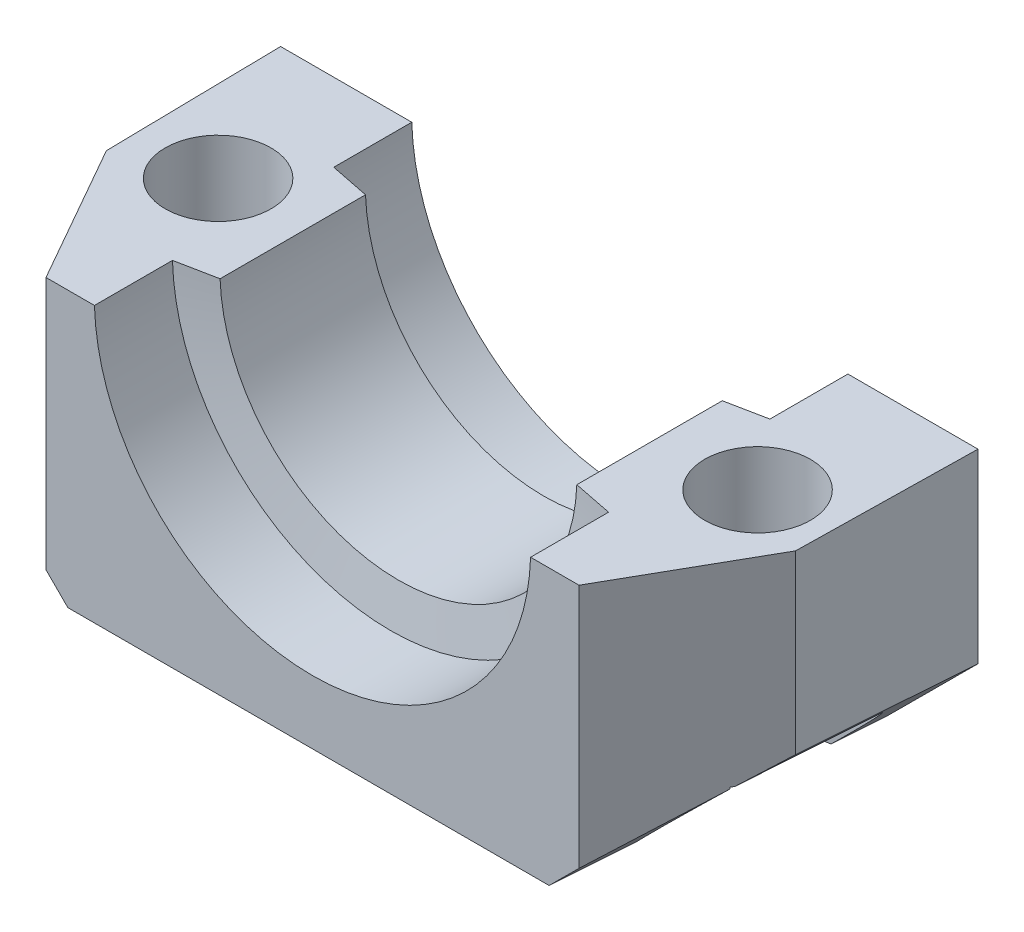
ISO-10303-21;
HEADER;
FILE_DESCRIPTION(('STEP AP214'),'2;1');
FILE_NAME('part.step','',(''),(''),'','','');
FILE_SCHEMA(('AUTOMOTIVE_DESIGN { 1 0 10303 214 1 1 1 1 }'));
ENDSEC;
DATA;
#1=APPLICATION_CONTEXT('core data for automotive mechanical design processes');
#2=APPLICATION_PROTOCOL_DEFINITION('international standard','automotive_design',2000,#1);
#3=PRODUCT_CONTEXT('',#1,'mechanical');
#4=PRODUCT('Part','Part','',(#3));
#5=PRODUCT_RELATED_PRODUCT_CATEGORY('part','',(#4));
#6=PRODUCT_DEFINITION_FORMATION('','',#4);
#7=PRODUCT_DEFINITION_CONTEXT('part definition',#1,'design');
#8=PRODUCT_DEFINITION('design','',#6,#7);
#9=PRODUCT_DEFINITION_SHAPE('','',#8);
#10=(LENGTH_UNIT() NAMED_UNIT(*) SI_UNIT(.MILLI.,.METRE.));
#11=(NAMED_UNIT(*) PLANE_ANGLE_UNIT() SI_UNIT($,.RADIAN.));
#12=(NAMED_UNIT(*) SI_UNIT($,.STERADIAN.) SOLID_ANGLE_UNIT());
#13=UNCERTAINTY_MEASURE_WITH_UNIT(LENGTH_MEASURE(1.E-05),#10,'distance_accuracy_value','');
#14=(GEOMETRIC_REPRESENTATION_CONTEXT(3) GLOBAL_UNCERTAINTY_ASSIGNED_CONTEXT((#13)) GLOBAL_UNIT_ASSIGNED_CONTEXT((#10,
#11,#12)) REPRESENTATION_CONTEXT('',''));
#15=CARTESIAN_POINT('',(0.,0.,0.));
#16=DIRECTION('',(0.,0.,1.));
#17=DIRECTION('',(1.,0.,0.));
#18=AXIS2_PLACEMENT_3D('',#15,#16,#17);
#19=CARTESIAN_POINT('',(74.7195,-65.6273640319845,32.1314205669099));
#20=DIRECTION('',(0.,0.,-1.));
#21=DIRECTION('',(0.,-1.,0.));
#22=AXIS2_PLACEMENT_3D('',#19,#20,#21);
#23=CYLINDRICAL_SURFACE('',#22,6.75);
#24=DIRECTION('',(0.,0.,1.));
#25=VECTOR('',#24,1.);
#26=CARTESIAN_POINT('',(81.4648687816164,-65.8773640319845,32.1314205669099));
#27=LINE('',#26,#25);
#28=CARTESIAN_POINT('',(81.4648687816164,-65.8773640319845,27.7999999999972));
#29=VERTEX_POINT('',#28);
#30=CARTESIAN_POINT('',(81.4648687816164,-65.8773640319845,33.2999999999972));
#31=VERTEX_POINT('',#30);
#32=EDGE_CURVE('E328',#29,#31,#27,.T.);
#33=ORIENTED_EDGE('',*,*,#32,.F.);
#34=CARTESIAN_POINT('',(74.7195,-65.6273640319846,27.7999999999972));
#35=DIRECTION('',(0.,0.,1.));
#36=DIRECTION('',(0.,1.,0.));
#37=AXIS2_PLACEMENT_3D('',#34,#35,#36);
#38=CIRCLE('',#37,6.75);
#39=CARTESIAN_POINT('',(67.9741312183843,-65.8773640319845,27.7999999999972));
#40=VERTEX_POINT('',#39);
#41=EDGE_CURVE('E283',#40,#29,#38,.T.);
#42=ORIENTED_EDGE('',*,*,#41,.F.);
#43=DIRECTION('',(0.,0.,-1.));
#44=VECTOR('',#43,1.);
#45=CARTESIAN_POINT('',(67.9741312183843,-65.8773640319845,32.1314205669099));
#46=LINE('',#45,#44);
#47=CARTESIAN_POINT('',(67.9741312183843,-65.8773640319845,33.2999999999972));
#48=VERTEX_POINT('',#47);
#49=EDGE_CURVE('E304',#48,#40,#46,.T.);
#50=ORIENTED_EDGE('',*,*,#49,.F.);
#51=CARTESIAN_POINT('',(74.7195,-65.6273640319845,33.2999999999972));
#52=DIRECTION('',(0.,0.,1.));
#53=DIRECTION('',(0.,1.,0.));
#54=AXIS2_PLACEMENT_3D('',#51,#52,#53);
#55=CIRCLE('',#54,6.75);
#56=EDGE_CURVE('E262',#48,#31,#55,.T.);
#57=ORIENTED_EDGE('',*,*,#56,.T.);
#58=EDGE_LOOP('',(#33,#42,#50,#57));
#59=FACE_BOUND('',#58,.T.);
#60=ADVANCED_FACE('F17',(#59),#23,.F.);
#61=CARTESIAN_POINT('',(74.7195,-65.627364031986,36.5499999999972));
#62=DIRECTION('',(0.,0.,-1.));
#63=DIRECTION('',(0.,-1.,0.));
#64=AXIS2_PLACEMENT_3D('',#61,#62,#63);
#65=PLANE('',#64);
#66=DIRECTION('',(0.,1.,0.));
#67=VECTOR('',#66,1.);
#68=CARTESIAN_POINT('',(64.6415,-68.352364031985,36.5499999999972));
#69=LINE('',#68,#67);
#70=CARTESIAN_POINT('',(64.6415,-75.4521268342688,36.5499999999973));
#71=VERTEX_POINT('',#70);
#72=CARTESIAN_POINT('',(64.6415,-65.8773640319845,36.5499999999972));
#73=VERTEX_POINT('',#72);
#74=EDGE_CURVE('E299',#71,#73,#69,.T.);
#75=ORIENTED_EDGE('',*,*,#74,.F.);
#76=DIRECTION('',(-0.707968543318457,0.706243967529311,0.));
#77=VECTOR('',#76,1.);
#78=CARTESIAN_POINT('',(66.142642401802,-76.9496125286265,36.5499999999973));
#79=LINE('',#78,#77);
#80=CARTESIAN_POINT('',(65.4687523428459,-76.2773640319845,36.5499999999973));
#81=VERTEX_POINT('',#80);
#82=EDGE_CURVE('E442',#81,#71,#79,.T.);
#83=ORIENTED_EDGE('',*,*,#82,.F.);
#84=DIRECTION('',(1.,0.,0.));
#85=VECTOR('',#84,1.);
#86=CARTESIAN_POINT('',(69.0945,-76.2773640319845,36.5499999999973));
#87=LINE('',#86,#85);
#88=CARTESIAN_POINT('',(83.6669141455119,-76.2773640319845,36.5499999999973));
#89=VERTEX_POINT('',#88);
#90=EDGE_CURVE('E279',#81,#89,#87,.T.);
#91=ORIENTED_EDGE('',*,*,#90,.T.);
#92=DIRECTION('',(-0.707968543318457,-0.70624396752931,0.));
#93=VECTOR('',#92,1.);
#94=CARTESIAN_POINT('',(83.1450607449544,-76.7979462238865,36.5499999999973));
#95=LINE('',#94,#93);
#96=CARTESIAN_POINT('',(84.7975000000009,-75.149532227814,36.5499999999973));
#97=VERTEX_POINT('',#96);
#98=EDGE_CURVE('E468',#97,#89,#95,.T.);
#99=ORIENTED_EDGE('',*,*,#98,.F.);
#100=DIRECTION('',(0.,-1.,0.));
#101=VECTOR('',#100,1.);
#102=CARTESIAN_POINT('',(84.7975,-69.1768111183165,36.5499999999972));
#103=LINE('',#102,#101);
#104=CARTESIAN_POINT('',(84.7975,-65.8773640319845,36.5499999999972));
#105=VERTEX_POINT('',#104);
#106=EDGE_CURVE('E11',#105,#97,#103,.T.);
#107=ORIENTED_EDGE('',*,*,#106,.F.);
#108=DIRECTION('',(-1.,0.,0.));
#109=VECTOR('',#108,1.);
#110=CARTESIAN_POINT('',(74.7195,-65.8773640319845,36.5499999999972));
#111=LINE('',#110,#109);
#112=CARTESIAN_POINT('',(82.9657112512353,-65.8773640319845,36.5499999999972));
#113=VERTEX_POINT('',#112);
#114=EDGE_CURVE('E332',#105,#113,#111,.T.);
#115=ORIENTED_EDGE('',*,*,#114,.T.);
#116=CARTESIAN_POINT('',(74.7195,-65.627364031983,36.5499999999972));
#117=DIRECTION('',(0.,0.,-1.));
#118=DIRECTION('',(0.,1.,0.));
#119=AXIS2_PLACEMENT_3D('',#116,#117,#118);
#120=CIRCLE('',#119,8.25);
#121=CARTESIAN_POINT('',(66.4732887487647,-65.8773640319845,36.5499999999972));
#122=VERTEX_POINT('',#121);
#123=EDGE_CURVE('E278',#113,#122,#120,.T.);
#124=ORIENTED_EDGE('',*,*,#123,.T.);
#125=DIRECTION('',(-1.,0.,0.));
#126=VECTOR('',#125,1.);
#127=CARTESIAN_POINT('',(74.7195,-65.8773640319845,36.5499999999972));
#128=LINE('',#127,#126);
#129=EDGE_CURVE('E289',#122,#73,#128,.T.);
#130=ORIENTED_EDGE('',*,*,#129,.T.);
#131=EDGE_LOOP('',(#75,#83,#91,#99,#107,#115,#124,#130));
#132=FACE_BOUND('',#131,.T.);
#133=ADVANCED_FACE('F506',(#132),#65,.F.);
#134=CARTESIAN_POINT('',(85.643017800899,-72.7262582046471,35.0635717147782));
#135=DIRECTION('',(0.869216267412119,0.,0.494432078718749));
#136=DIRECTION('',(0.,-1.,0.));
#137=AXIS2_PLACEMENT_3D('',#134,#135,#136);
#138=PLANE('',#137);
#139=DIRECTION('',(0.494432078718749,0.,-0.869216267412119));
#140=VECTOR('',#139,1.);
#141=CARTESIAN_POINT('',(85.6589690168994,-73.2773640319845,35.0355293262899));
#142=LINE('',#141,#140);
#143=CARTESIAN_POINT('',(86.8683590580363,-73.2773640319834,32.9094102036663));
#144=VERTEX_POINT('',#143);
#145=CARTESIAN_POINT('',(86.9372882853201,-73.2773640319845,32.7882319706308));
#146=VERTEX_POINT('',#145);
#147=EDGE_CURVE('E255',#144,#146,#142,.T.);
#148=ORIENTED_EDGE('',*,*,#147,.T.);
#149=DIRECTION('',(-0.453791213813399,-0.397036231984776,0.797769242799629));
#150=VECTOR('',#149,1.);
#151=CARTESIAN_POINT('',(86.0949788380888,-74.014327108646,34.2690199397803));
#152=LINE('',#151,#150);
#153=CARTESIAN_POINT('',(87.7674035144998,-72.5510700609377,31.3288815520671));
#154=VERTEX_POINT('',#153);
#155=EDGE_CURVE('E271',#154,#146,#152,.T.);
#156=ORIENTED_EDGE('',*,*,#155,.F.);
#157=DIRECTION('',(0.,1.,0.));
#158=VECTOR('',#157,1.);
#159=CARTESIAN_POINT('',(87.7674035144998,-69.1874964435554,31.328881552067));
#160=LINE('',#159,#158);
#161=CARTESIAN_POINT('',(87.7674035144998,-65.8773640319845,31.328881552067));
#162=VERTEX_POINT('',#161);
#163=EDGE_CURVE('E361',#154,#162,#160,.T.);
#164=ORIENTED_EDGE('',*,*,#163,.T.);
#165=DIRECTION('',(-0.494432078718749,0.,0.869216267412119));
#166=VECTOR('',#165,1.);
#167=CARTESIAN_POINT('',(93.2963989890606,-65.8773640319845,21.6088552516092));
#168=LINE('',#167,#166);
#169=EDGE_CURVE('E28',#162,#105,#168,.T.);
#170=ORIENTED_EDGE('',*,*,#169,.T.);
#171=ORIENTED_EDGE('',*,*,#106,.T.);
#172=DIRECTION('',(-0.453791213813399,-0.397036231984776,0.797769242799629));
#173=VECTOR('',#172,1.);
#174=CARTESIAN_POINT('',(86.0949788380888,-74.014327108646,34.2690199397803));
#175=LINE('',#174,#173);
#176=CARTESIAN_POINT('',(86.8683590580363,-73.3376723849039,32.9094102036663));
#177=VERTEX_POINT('',#176);
#178=EDGE_CURVE('E453',#177,#97,#175,.T.);
#179=ORIENTED_EDGE('',*,*,#178,.F.);
#180=DIRECTION('',(0.,1.,0.));
#181=VECTOR('',#180,1.);
#182=CARTESIAN_POINT('',(86.8683590580364,-76.2773640319834,32.9094102036663));
#183=LINE('',#182,#181);
#184=EDGE_CURVE('E358',#177,#144,#183,.T.);
#185=ORIENTED_EDGE('',*,*,#184,.T.);
#186=EDGE_LOOP('',(#148,#156,#164,#170,#171,#179,#185));
#187=FACE_BOUND('',#186,.T.);
#188=ADVANCED_FACE('F531',(#187),#138,.T.);
#189=CARTESIAN_POINT('',(74.7195,-65.627364031983,36.5499999999972));
#190=DIRECTION('',(0.,0.,-1.));
#191=DIRECTION('',(0.,-1.,0.));
#192=AXIS2_PLACEMENT_3D('',#189,#190,#191);
#193=CYLINDRICAL_SURFACE('',#192,8.25);
#194=CARTESIAN_POINT('',(74.7195,-65.6273640319846,27.4999999999972));
#195=DIRECTION('',(0.,0.,1.));
#196=DIRECTION('',(0.,1.,0.));
#197=AXIS2_PLACEMENT_3D('',#194,#195,#196);
#198=CIRCLE('',#197,8.25);
#199=CARTESIAN_POINT('',(66.4732887487647,-65.8773640319845,27.4999999999972));
#200=VERTEX_POINT('',#199);
#201=CARTESIAN_POINT('',(82.9657112512356,-65.8773640319845,27.4999999999972));
#202=VERTEX_POINT('',#201);
#203=EDGE_CURVE('E320',#200,#202,#198,.T.);
#204=ORIENTED_EDGE('',*,*,#203,.T.);
#205=DIRECTION('',(0.,0.,1.));
#206=VECTOR('',#205,1.);
#207=CARTESIAN_POINT('',(82.9657112512353,-65.8773640319845,36.5499999999972));
#208=LINE('',#207,#206);
#209=CARTESIAN_POINT('',(82.9657112512353,-65.8773640319846,24.5499999999972));
#210=VERTEX_POINT('',#209);
#211=EDGE_CURVE('E277',#210,#202,#208,.T.);
#212=ORIENTED_EDGE('',*,*,#211,.F.);
#213=CARTESIAN_POINT('',(74.7195,-65.627364031983,24.5499999999972));
#214=DIRECTION('',(0.,0.,-1.));
#215=DIRECTION('',(0.,1.,0.));
#216=AXIS2_PLACEMENT_3D('',#213,#214,#215);
#217=CIRCLE('',#216,8.25);
#218=CARTESIAN_POINT('',(66.4732887487647,-65.8773640319845,24.5499999999972));
#219=VERTEX_POINT('',#218);
#220=EDGE_CURVE('E310',#210,#219,#217,.T.);
#221=ORIENTED_EDGE('',*,*,#220,.T.);
#222=DIRECTION('',(0.,0.,-1.));
#223=VECTOR('',#222,1.);
#224=CARTESIAN_POINT('',(66.4732887487647,-65.8773640319845,36.5499999999972));
#225=LINE('',#224,#223);
#226=EDGE_CURVE('E391',#200,#219,#225,.T.);
#227=ORIENTED_EDGE('',*,*,#226,.F.);
#228=EDGE_LOOP('',(#204,#212,#221,#227));
#229=FACE_BOUND('',#228,.T.);
#230=ADVANCED_FACE('F389',(#229),#193,.F.);
#231=CARTESIAN_POINT('',(62.9695000000013,-65.8773640319845,-13.4500000000029));
#232=DIRECTION('',(0.,-1.,0.));
#233=DIRECTION('',(-1.,0.,0.));
#234=AXIS2_PLACEMENT_3D('',#231,#232,#233);
#235=PLANE('',#234);
#236=CARTESIAN_POINT('',(85.05,-65.8773640319834,30.0499999999974));
#237=DIRECTION('',(0.,-1.,0.));
#238=DIRECTION('',(1.,0.,0.));
#239=AXIS2_PLACEMENT_3D('',#236,#237,#238);
#240=CIRCLE('',#239,2.);
#241=CARTESIAN_POINT('',(83.05,-65.8773640319834,30.0499999999974));
#242=VERTEX_POINT('',#241);
#243=EDGE_CURVE('E249',#242,#242,#240,.T.);
#244=ORIENTED_EDGE('',*,*,#243,.T.);
#245=EDGE_LOOP('',(#244));
#246=FACE_BOUND('',#245,.T.);
#247=DIRECTION('',(-0.0174524064372835,0.,0.999847695156391));
#248=VECTOR('',#247,1.);
#249=CARTESIAN_POINT('',(88.3496446745002,-65.8773640319845,-2.02769216420523));
#250=LINE('',#249,#248);
#251=CARTESIAN_POINT('',(87.8857293321319,-65.8773640319845,24.5499999999972));
#252=VERTEX_POINT('',#251);
#253=EDGE_CURVE('E365',#252,#162,#250,.T.);
#254=ORIENTED_EDGE('',*,*,#253,.F.);
#255=DIRECTION('',(-1.,0.,0.));
#256=VECTOR('',#255,1.);
#257=CARTESIAN_POINT('',(74.7195,-65.8773640319845,24.5499999999972));
#258=LINE('',#257,#256);
#259=EDGE_CURVE('E313',#252,#210,#258,.T.);
#260=ORIENTED_EDGE('',*,*,#259,.T.);
#261=ORIENTED_EDGE('',*,*,#211,.T.);
#262=CARTESIAN_POINT('',(82.9657112512356,-65.8773640319845,27.4999999999972));
#263=CARTESIAN_POINT('',(82.1402478929447,-65.8773640319845,27.6650168541214));
#264=CARTESIAN_POINT('',(81.4648687816158,-65.8773640319846,27.7999999999973));
#265=(BOUNDED_CURVE() B_SPLINE_CURVE(2,(#262,#263,#264),.UNSPECIFIED.,.F.,
.F.) B_SPLINE_CURVE_WITH_KNOTS((3,3),(-5.64834179297389,-5.62956906046879),
.UNSPECIFIED.) CURVE() GEOMETRIC_REPRESENTATION_ITEM() RATIONAL_B_SPLINE_CURVE((3.32352941176481,
3.68082217396358,4.03571428571474)) REPRESENTATION_ITEM(''));
#266=EDGE_CURVE('E314',#202,#29,#265,.T.);
#267=ORIENTED_EDGE('',*,*,#266,.T.);
#268=ORIENTED_EDGE('',*,*,#32,.T.);
#269=CARTESIAN_POINT('',(81.4648687816165,-65.8773640319845,33.2999999999972));
#270=CARTESIAN_POINT('',(82.1402478929451,-65.8773640319845,33.4349831458731));
#271=CARTESIAN_POINT('',(82.9657112512356,-65.8773640319844,33.5999999999972));
#272=(BOUNDED_CURVE() B_SPLINE_CURVE(2,(#269,#270,#271),.UNSPECIFIED.,.F.,
.F.) B_SPLINE_CURVE_WITH_KNOTS((3,3),(-0.0791610960547726,-0.0603883635496829),
.UNSPECIFIED.) CURVE() GEOMETRIC_REPRESENTATION_ITEM() RATIONAL_B_SPLINE_CURVE((4.03571428571438,
3.68082217396338,3.32352941176478)) REPRESENTATION_ITEM(''));
#273=CARTESIAN_POINT('',(82.9657112512356,-65.8773640319845,33.5999999999972));
#274=VERTEX_POINT('',#273);
#275=EDGE_CURVE('E256',#31,#274,#272,.T.);
#276=ORIENTED_EDGE('',*,*,#275,.T.);
#277=DIRECTION('',(0.,0.,1.));
#278=VECTOR('',#277,1.);
#279=CARTESIAN_POINT('',(82.9657112512353,-65.8773640319845,36.5499999999972));
#280=LINE('',#279,#278);
#281=EDGE_CURVE('E273',#274,#113,#280,.T.);
#282=ORIENTED_EDGE('',*,*,#281,.T.);
#283=ORIENTED_EDGE('',*,*,#114,.F.);
#284=ORIENTED_EDGE('',*,*,#169,.F.);
#285=EDGE_LOOP('',(#254,#260,#261,#267,#268,#276,#282,#283,#284));
#286=FACE_BOUND('',#285,.T.);
#287=ADVANCED_FACE('F382',(#246,#286),#235,.F.);
#288=CARTESIAN_POINT('',(74.7195,-65.627364031983,36.5499999999972));
#289=DIRECTION('',(0.,0.,-1.));
#290=DIRECTION('',(0.,-1.,0.));
#291=AXIS2_PLACEMENT_3D('',#288,#289,#290);
#292=CYLINDRICAL_SURFACE('',#291,8.25);
#293=DIRECTION('',(0.,0.,-1.));
#294=VECTOR('',#293,1.);
#295=CARTESIAN_POINT('',(66.4732887487647,-65.8773640319845,36.5499999999972));
#296=LINE('',#295,#294);
#297=CARTESIAN_POINT('',(66.4732887487647,-65.8773640319845,33.5999999999972));
#298=VERTEX_POINT('',#297);
#299=EDGE_CURVE('E327',#122,#298,#296,.T.);
#300=ORIENTED_EDGE('',*,*,#299,.F.);
#301=ORIENTED_EDGE('',*,*,#123,.F.);
#302=ORIENTED_EDGE('',*,*,#281,.F.);
#303=CARTESIAN_POINT('',(74.7195,-65.6273640319845,33.5999999999972));
#304=DIRECTION('',(0.,0.,1.));
#305=DIRECTION('',(0.,1.,0.));
#306=AXIS2_PLACEMENT_3D('',#303,#304,#305);
#307=CIRCLE('',#306,8.25);
#308=EDGE_CURVE('E263',#298,#274,#307,.T.);
#309=ORIENTED_EDGE('',*,*,#308,.F.);
#310=EDGE_LOOP('',(#300,#301,#302,#309));
#311=FACE_BOUND('',#310,.T.);
#312=ADVANCED_FACE('F510',(#311),#292,.F.);
#313=CARTESIAN_POINT('',(74.7195,-65.6273640319845,33.5999999999972));
#314=DIRECTION('',(0.,0.,1.));
#315=DIRECTION('',(0.,-1.,0.));
#316=AXIS2_PLACEMENT_3D('',#313,#314,#315);
#317=CONICAL_SURFACE('',#316,8.25,1.37340076694502);
#318=ORIENTED_EDGE('',*,*,#308,.T.);
#319=ORIENTED_EDGE('',*,*,#275,.F.);
#320=ORIENTED_EDGE('',*,*,#56,.F.);
#321=CARTESIAN_POINT('',(66.4732887487649,-65.8773640319845,33.5999999999972));
#322=CARTESIAN_POINT('',(67.2987521070558,-65.8773640319845,33.434983145873));
#323=CARTESIAN_POINT('',(67.9741312183848,-65.8773640319845,33.2999999999971));
#324=(BOUNDED_CURVE() B_SPLINE_CURVE(2,(#321,#322,#323),.UNSPECIFIED.,.F.,
.F.) B_SPLINE_CURVE_WITH_KNOTS((3,3),(-5.64834179297383,-5.62956906046873),
.UNSPECIFIED.) CURVE() GEOMETRIC_REPRESENTATION_ITEM() RATIONAL_B_SPLINE_CURVE((3.3235294117647,
3.6808221739635,4.0357142857147)) REPRESENTATION_ITEM(''));
#325=EDGE_CURVE('E309',#298,#48,#324,.T.);
#326=ORIENTED_EDGE('',*,*,#325,.F.);
#327=EDGE_LOOP('',(#318,#319,#320,#326));
#328=FACE_BOUND('',#327,.T.);
#329=ADVANCED_FACE('F541',(#328),#317,.F.);
#330=CARTESIAN_POINT('',(74.7195,-65.6273640319846,27.7999999999972));
#331=DIRECTION('',(0.,0.,-1.));
#332=DIRECTION('',(0.,-1.,0.));
#333=AXIS2_PLACEMENT_3D('',#330,#331,#332);
#334=CONICAL_SURFACE('',#333,6.75,1.37340076694502);
#335=ORIENTED_EDGE('',*,*,#41,.T.);
#336=ORIENTED_EDGE('',*,*,#266,.F.);
#337=ORIENTED_EDGE('',*,*,#203,.F.);
#338=CARTESIAN_POINT('',(67.9741312183848,-65.8773640319845,27.7999999999973));
#339=CARTESIAN_POINT('',(67.2987521070558,-65.8773640319845,27.6650168541213));
#340=CARTESIAN_POINT('',(66.4732887487648,-65.8773640319845,27.4999999999972));
#341=(BOUNDED_CURVE() B_SPLINE_CURVE(2,(#338,#339,#340),.UNSPECIFIED.,.F.,
.F.) B_SPLINE_CURVE_WITH_KNOTS((3,3),(-0.635693768744279,-0.517208865063031),
.UNSPECIFIED.) CURVE() GEOMETRIC_REPRESENTATION_ITEM() RATIONAL_B_SPLINE_CURVE((25.4642857142881,
23.2250107082828,20.9705882352939)) REPRESENTATION_ITEM(''));
#342=EDGE_CURVE('E308',#40,#200,#341,.T.);
#343=ORIENTED_EDGE('',*,*,#342,.F.);
#344=EDGE_LOOP('',(#335,#336,#337,#343));
#345=FACE_BOUND('',#344,.T.);
#346=ADVANCED_FACE('F19',(#345),#334,.F.);
#347=CARTESIAN_POINT('',(63.4695000000013,-76.2773640319845,-13.4510000000029));
#348=DIRECTION('',(0.,1.,0.));
#349=DIRECTION('',(1.,0.,0.));
#350=AXIS2_PLACEMENT_3D('',#347,#348,#349);
#351=PLANE('',#350);
#352=DIRECTION('',(1.,0.,0.));
#353=VECTOR('',#352,1.);
#354=CARTESIAN_POINT('',(69.0186666220901,-76.2773640319845,24.5499999999973));
#355=LINE('',#354,#353);
#356=CARTESIAN_POINT('',(64.6296305995235,-76.2773640319844,24.5499999999973));
#357=VERTEX_POINT('',#356);
#358=CARTESIAN_POINT('',(84.5060358888344,-76.2773640319844,24.5499999999973));
#359=VERTEX_POINT('',#358);
#360=EDGE_CURVE('E413',#357,#359,#355,.T.);
#361=ORIENTED_EDGE('',*,*,#360,.T.);
#362=DIRECTION('',(0.0697564737441488,0.,-0.997564050259823));
#363=VECTOR('',#362,1.);
#364=CARTESIAN_POINT('',(85.60361205377,-76.2773640319845,8.85392957393585));
#365=LINE('',#364,#363);
#366=CARTESIAN_POINT('',(84.3638094210118,-76.2773640319834,26.5839332492119));
#367=VERTEX_POINT('',#366);
#368=EDGE_CURVE('E343',#367,#359,#365,.T.);
#369=ORIENTED_EDGE('',*,*,#368,.F.);
#370=CARTESIAN_POINT('',(84.85,-76.2773640319845,30.0499999999977));
#371=DIRECTION('',(0.,1.,0.));
#372=DIRECTION('',(1.,0.,0.));
#373=AXIS2_PLACEMENT_3D('',#370,#371,#372);
#374=CIRCLE('',#373,3.5);
#375=CARTESIAN_POINT('',(83.8861577364624,-76.2773640319834,33.4146705768919));
#376=VERTEX_POINT('',#375);
#377=EDGE_CURVE('E192',#367,#376,#374,.T.);
#378=ORIENTED_EDGE('',*,*,#377,.T.);
#379=DIRECTION('',(0.0697564737441488,0.,-0.997564050259823));
#380=VECTOR('',#379,1.);
#381=CARTESIAN_POINT('',(85.60361205377,-76.2773640319845,8.85392957393585));
#382=LINE('',#381,#380);
#383=EDGE_CURVE('E300',#89,#376,#382,.T.);
#384=ORIENTED_EDGE('',*,*,#383,.F.);
#385=ORIENTED_EDGE('',*,*,#90,.F.);
#386=DIRECTION('',(0.069756473744149,0.,0.997564050259823));
#387=VECTOR('',#386,1.);
#388=CARTESIAN_POINT('',(63.478788331701,-76.2773640319845,8.09218881375554));
#389=LINE('',#388,#387);
#390=CARTESIAN_POINT('',(65.2573089860889,-76.2773640319834,33.5262191228166));
#391=VERTEX_POINT('',#390);
#392=EDGE_CURVE('E438',#391,#81,#389,.T.);
#393=ORIENTED_EDGE('',*,*,#392,.F.);
#394=CARTESIAN_POINT('',(64.85,-76.2773640319845,30.0499999999977));
#395=DIRECTION('',(0.,1.,0.));
#396=DIRECTION('',(1.,0.,0.));
#397=AXIS2_PLACEMENT_3D('',#394,#395,#396);
#398=CIRCLE('',#397,3.5);
#399=CARTESIAN_POINT('',(64.7695488880947,-76.2773640319834,26.5509247480785));
#400=VERTEX_POINT('',#399);
#401=EDGE_CURVE('E233',#391,#400,#398,.T.);
#402=ORIENTED_EDGE('',*,*,#401,.T.);
#403=DIRECTION('',(0.069756473744149,0.,0.997564050259823));
#404=VECTOR('',#403,1.);
#405=CARTESIAN_POINT('',(63.478788331701,-76.2773640319845,8.09218881375554));
#406=LINE('',#405,#404);
#407=EDGE_CURVE('E364',#357,#400,#406,.T.);
#408=ORIENTED_EDGE('',*,*,#407,.F.);
#409=EDGE_LOOP('',(#361,#369,#378,#384,#385,#393,#402,#408));
#410=FACE_BOUND('',#409,.T.);
#411=ADVANCED_FACE('F414',(#410),#351,.F.);
#412=CARTESIAN_POINT('',(64.65,-65.0310000000014,30.0499999999974));
#413=DIRECTION('',(0.,-1.,0.));
#414=DIRECTION('',(1.,0.,0.));
#415=AXIS2_PLACEMENT_3D('',#412,#413,#414);
#416=CYLINDRICAL_SURFACE('',#415,2.);
#417=CARTESIAN_POINT('',(64.65,-65.8773640319834,30.0499999999974));
#418=DIRECTION('',(0.,-1.,0.));
#419=DIRECTION('',(1.,0.,0.));
#420=AXIS2_PLACEMENT_3D('',#417,#418,#419);
#421=CIRCLE('',#420,2.);
#422=CARTESIAN_POINT('',(62.65,-65.8773640319834,30.0499999999974));
#423=VERTEX_POINT('',#422);
#424=EDGE_CURVE('E351',#423,#423,#421,.T.);
#425=ORIENTED_EDGE('',*,*,#424,.F.);
#426=DIRECTION('',(0.,-1.,0.));
#427=VECTOR('',#426,1.);
#428=CARTESIAN_POINT('',(62.65,-65.0310000000014,30.0499999999974));
#429=LINE('',#428,#427);
#430=CARTESIAN_POINT('',(62.65,-73.2773640319845,30.0499999999976));
#431=VERTEX_POINT('',#430);
#432=EDGE_CURVE('E284',#423,#431,#429,.T.);
#433=ORIENTED_EDGE('',*,*,#432,.T.);
#434=CARTESIAN_POINT('',(64.65,-73.2773640319845,30.0499999999976));
#435=DIRECTION('',(0.,-1.,0.));
#436=DIRECTION('',(1.,0.,0.));
#437=AXIS2_PLACEMENT_3D('',#434,#435,#436);
#438=CIRCLE('',#437,2.);
#439=EDGE_CURVE('E222',#431,#431,#438,.T.);
#440=ORIENTED_EDGE('',*,*,#439,.T.);
#441=ORIENTED_EDGE('',*,*,#432,.F.);
#442=EDGE_LOOP('',(#425,#433,#440,#441));
#443=FACE_BOUND('',#442,.T.);
#444=ADVANCED_FACE('F609',(#443),#416,.F.);
#445=CARTESIAN_POINT('',(85.05,-65.0310000000014,30.0499999999974));
#446=DIRECTION('',(0.,-1.,0.));
#447=DIRECTION('',(1.,0.,0.));
#448=AXIS2_PLACEMENT_3D('',#445,#446,#447);
#449=CYLINDRICAL_SURFACE('',#448,2.);
#450=ORIENTED_EDGE('',*,*,#243,.F.);
#451=DIRECTION('',(0.,-1.,0.));
#452=VECTOR('',#451,1.);
#453=CARTESIAN_POINT('',(83.05,-65.0310000000014,30.0499999999974));
#454=LINE('',#453,#452);
#455=CARTESIAN_POINT('',(83.05,-73.2773640319845,30.0499999999976));
#456=VERTEX_POINT('',#455);
#457=EDGE_CURVE('E366',#242,#456,#454,.T.);
#458=ORIENTED_EDGE('',*,*,#457,.T.);
#459=CARTESIAN_POINT('',(85.05,-73.2773640319845,30.0499999999976));
#460=DIRECTION('',(0.,-1.,0.));
#461=DIRECTION('',(1.,0.,0.));
#462=AXIS2_PLACEMENT_3D('',#459,#460,#461);
#463=CIRCLE('',#462,2.);
#464=EDGE_CURVE('E355',#456,#456,#463,.T.);
#465=ORIENTED_EDGE('',*,*,#464,.T.);
#466=ORIENTED_EDGE('',*,*,#457,.F.);
#467=EDGE_LOOP('',(#450,#458,#465,#466));
#468=FACE_BOUND('',#467,.T.);
#469=ADVANCED_FACE('F606',(#468),#449,.F.);
#470=CARTESIAN_POINT('',(67.254506764673,-78.5594801926323,29.3720031781239));
#471=DIRECTION('',(-0.705384304606641,-0.707106781186545,0.0493252756161493));
#472=DIRECTION('',(-0.707968543318457,0.706243967529311,0.));
#473=AXIS2_PLACEMENT_3D('',#470,#471,#472);
#474=PLANE('',#473);
#475=CARTESIAN_POINT('',(64.85,-76.1135360180847,30.0499999999977));
#476=DIRECTION('',(0.705384304606641,0.707106781186545,-0.0493252756161493));
#477=DIRECTION('',(0.705384304606636,-0.70710678118655,-0.0493252756161488));
#478=AXIS2_PLACEMENT_3D('',#475,#476,#477);
#479=ELLIPSE('',#478,4.94974746830586,3.5);
#480=CARTESIAN_POINT('',(62.3195928300728,-73.4206170877058,32.4680652502296));
#481=VERTEX_POINT('',#480);
#482=EDGE_CURVE('E223',#481,#391,#479,.T.);
#483=ORIENTED_EDGE('',*,*,#482,.T.);
#484=ORIENTED_EDGE('',*,*,#392,.T.);
#485=ORIENTED_EDGE('',*,*,#82,.T.);
#486=DIRECTION('',(0.45379121381342,-0.397036231984799,0.797769242799605));
#487=VECTOR('',#486,1.);
#488=CARTESIAN_POINT('',(63.1386705170434,-74.1372539652794,33.9080115652704));
#489=LINE('',#488,#487);
#490=EDGE_CURVE('E296',#481,#71,#489,.T.);
#491=ORIENTED_EDGE('',*,*,#490,.F.);
#492=EDGE_LOOP('',(#483,#484,#485,#491));
#493=FACE_BOUND('',#492,.T.);
#494=ADVANCED_FACE('F522',(#493),#474,.T.);
#495=CARTESIAN_POINT('',(63.7905456019244,-71.077364031984,35.0540141255564));
#496=DIRECTION('',(-0.869216267412106,0.,0.494432078718772));
#497=DIRECTION('',(0.,1.,0.));
#498=AXIS2_PLACEMENT_3D('',#495,#496,#497);
#499=PLANE('',#498);
#500=DIRECTION('',(0.494432078718772,0.,0.869216267412106));
#501=VECTOR('',#500,1.);
#502=CARTESIAN_POINT('',(63.8092151165139,-73.2773640319845,35.0868353086559));
#503=LINE('',#502,#501);
#504=CARTESIAN_POINT('',(62.1558622362344,-73.2773640319845,32.1802253187951));
#505=VERTEX_POINT('',#504);
#506=CARTESIAN_POINT('',(62.3195928300728,-73.2773640319834,32.4680652502296));
#507=VERTEX_POINT('',#506);
#508=EDGE_CURVE('E210',#505,#507,#503,.T.);
#509=ORIENTED_EDGE('',*,*,#508,.T.);
#510=DIRECTION('',(0.,-1.,0.));
#511=VECTOR('',#510,1.);
#512=CARTESIAN_POINT('',(62.3195928300728,-76.2773640319834,32.4680652502296));
#513=LINE('',#512,#511);
#514=EDGE_CURVE('E215',#507,#481,#513,.T.);
#515=ORIENTED_EDGE('',*,*,#514,.T.);
#516=ORIENTED_EDGE('',*,*,#490,.T.);
#517=ORIENTED_EDGE('',*,*,#74,.T.);
#518=DIRECTION('',(-0.494432078718772,0.,-0.869216267412106));
#519=VECTOR('',#518,1.);
#520=CARTESIAN_POINT('',(53.2674415168743,-65.8773640319845,16.5542976870546));
#521=LINE('',#520,#519);
#522=CARTESIAN_POINT('',(61.63070927712,-65.8773640319845,31.2570014532954));
#523=VERTEX_POINT('',#522);
#524=EDGE_CURVE('E285',#73,#523,#521,.T.);
#525=ORIENTED_EDGE('',*,*,#524,.T.);
#526=DIRECTION('',(0.,-1.,0.));
#527=VECTOR('',#526,1.);
#528=CARTESIAN_POINT('',(61.63070927712,-68.3523640319842,31.2570014532954));
#529=LINE('',#528,#527);
#530=CARTESIAN_POINT('',(61.63070927712,-72.8178911604181,31.2570014532954));
#531=VERTEX_POINT('',#530);
#532=EDGE_CURVE('E21',#523,#531,#529,.T.);
#533=ORIENTED_EDGE('',*,*,#532,.T.);
#534=DIRECTION('',(0.45379121381342,-0.397036231984799,0.797769242799605));
#535=VECTOR('',#534,1.);
#536=CARTESIAN_POINT('',(63.1386705170434,-74.1372539652794,33.9080115652704));
#537=LINE('',#536,#535);
#538=EDGE_CURVE('E217',#531,#505,#537,.T.);
#539=ORIENTED_EDGE('',*,*,#538,.T.);
#540=EDGE_LOOP('',(#509,#515,#516,#517,#525,#533,#539));
#541=FACE_BOUND('',#540,.T.);
#542=ADVANCED_FACE('F212',(#541),#499,.T.);
#543=CARTESIAN_POINT('',(82.0335644847276,-78.4081828894049,29.3614492117637));
#544=DIRECTION('',(0.70538430460664,-0.707106781186546,0.049325275616149));
#545=DIRECTION('',(0.,-0.0695873743166882,-0.997575860441555));
#546=AXIS2_PLACEMENT_3D('',#543,#544,#545);
#547=PLANE('',#546);
#548=CARTESIAN_POINT('',(84.85,-75.5505771945128,30.0499999999977));
#549=DIRECTION('',(-0.70538430460664,0.707106781186546,-0.049325275616149));
#550=DIRECTION('',(0.705384304606637,0.707106781186549,0.0493252756161489));
#551=AXIS2_PLACEMENT_3D('',#548,#549,#550);
#552=ELLIPSE('',#551,4.94974746830584,3.5);
#553=EDGE_CURVE('E245',#376,#177,#552,.T.);
#554=ORIENTED_EDGE('',*,*,#553,.T.);
#555=ORIENTED_EDGE('',*,*,#178,.T.);
#556=ORIENTED_EDGE('',*,*,#98,.T.);
#557=ORIENTED_EDGE('',*,*,#383,.T.);
#558=EDGE_LOOP('',(#554,#555,#556,#557));
#559=FACE_BOUND('',#558,.T.);
#560=ADVANCED_FACE('F529',(#559),#547,.T.);
#561=CARTESIAN_POINT('',(74.85,-73.2773640319845,28.8499999999975));
#562=DIRECTION('',(0.,-1.,0.));
#563=DIRECTION('',(0.,0.,-1.));
#564=AXIS2_PLACEMENT_3D('',#561,#562,#563);
#565=PLANE('',#564);
#566=ORIENTED_EDGE('',*,*,#439,.F.);
#567=EDGE_LOOP('',(#566));
#568=FACE_BOUND('',#567,.T.);
#569=ORIENTED_EDGE('',*,*,#508,.F.);
#570=DIRECTION('',(0.069756473744149,0.,0.997564050259823));
#571=VECTOR('',#570,1.);
#572=CARTESIAN_POINT('',(61.9855750777717,-73.2773640319845,29.7450054978165));
#573=LINE('',#572,#571);
#574=CARTESIAN_POINT('',(61.8776742945678,-73.2773640319835,28.2019524083961));
#575=VERTEX_POINT('',#574);
#576=EDGE_CURVE('E228',#575,#505,#573,.T.);
#577=ORIENTED_EDGE('',*,*,#576,.F.);
#578=CARTESIAN_POINT('',(64.85,-73.2773640319834,30.0499999999977));
#579=DIRECTION('',(0.,1.,0.));
#580=DIRECTION('',(1.,0.,0.));
#581=AXIS2_PLACEMENT_3D('',#578,#579,#580);
#582=CIRCLE('',#581,3.5);
#583=EDGE_CURVE('E226',#507,#575,#582,.T.);
#584=ORIENTED_EDGE('',*,*,#583,.F.);
#585=EDGE_LOOP('',(#569,#577,#584));
#586=FACE_BOUND('',#585,.T.);
#587=ADVANCED_FACE('F227',(#568,#586),#565,.T.);
#588=CARTESIAN_POINT('',(64.85,-76.2773640319834,30.0499999999977));
#589=DIRECTION('',(0.,1.,0.));
#590=DIRECTION('',(1.,0.,0.));
#591=AXIS2_PLACEMENT_3D('',#588,#589,#590);
#592=CYLINDRICAL_SURFACE('',#591,3.5);
#593=ORIENTED_EDGE('',*,*,#514,.F.);
#594=ORIENTED_EDGE('',*,*,#583,.T.);
#595=CARTESIAN_POINT('',(64.85,-76.1135360180847,30.0499999999977));
#596=DIRECTION('',(0.705384304606641,0.707106781186545,-0.0493252756161493));
#597=DIRECTION('',(0.705384304606636,-0.70710678118655,-0.0493252756161488));
#598=AXIS2_PLACEMENT_3D('',#595,#596,#597);
#599=ELLIPSE('',#598,4.94974746830586,3.5);
#600=EDGE_CURVE('E354',#400,#575,#599,.T.);
#601=ORIENTED_EDGE('',*,*,#600,.F.);
#602=ORIENTED_EDGE('',*,*,#401,.F.);
#603=ORIENTED_EDGE('',*,*,#482,.F.);
#604=EDGE_LOOP('',(#593,#594,#601,#602,#603));
#605=FACE_BOUND('',#604,.T.);
#606=ADVANCED_FACE('F236',(#605),#592,.F.);
#607=CARTESIAN_POINT('',(84.85,-76.2773640319834,30.0499999999977));
#608=DIRECTION('',(0.,1.,0.));
#609=DIRECTION('',(-0.996718287318708,0.,-0.0809484757389564));
#610=AXIS2_PLACEMENT_3D('',#607,#608,#609);
#611=CYLINDRICAL_SURFACE('',#610,3.5);
#612=ORIENTED_EDGE('',*,*,#184,.F.);
#613=ORIENTED_EDGE('',*,*,#553,.F.);
#614=ORIENTED_EDGE('',*,*,#377,.F.);
#615=CARTESIAN_POINT('',(84.85,-75.5505771945128,30.0499999999977));
#616=DIRECTION('',(-0.70538430460664,0.707106781186546,-0.049325275616149));
#617=DIRECTION('',(0.705384304606637,0.707106781186549,0.0493252756161489));
#618=AXIS2_PLACEMENT_3D('',#615,#616,#617);
#619=ELLIPSE('',#618,4.94974746830584,3.5);
#620=CARTESIAN_POINT('',(87.3033184263851,-73.2773640319834,27.5537570833805));
#621=VERTEX_POINT('',#620);
#622=EDGE_CURVE('E295',#621,#367,#619,.T.);
#623=ORIENTED_EDGE('',*,*,#622,.F.);
#624=CARTESIAN_POINT('',(84.85,-73.2773640319834,30.0499999999977));
#625=DIRECTION('',(0.,1.,0.));
#626=DIRECTION('',(1.,0.,0.));
#627=AXIS2_PLACEMENT_3D('',#624,#625,#626);
#628=CIRCLE('',#627,3.5);
#629=EDGE_CURVE('E359',#621,#144,#628,.T.);
#630=ORIENTED_EDGE('',*,*,#629,.T.);
#631=EDGE_LOOP('',(#612,#613,#614,#623,#630));
#632=FACE_BOUND('',#631,.T.);
#633=ADVANCED_FACE('F535',(#632),#611,.F.);
#634=CARTESIAN_POINT('',(74.85,-73.2773640319845,28.8499999999975));
#635=DIRECTION('',(0.,-1.,0.));
#636=DIRECTION('',(0.,0.,-1.));
#637=AXIS2_PLACEMENT_3D('',#634,#635,#636);
#638=PLANE('',#637);
#639=ORIENTED_EDGE('',*,*,#464,.F.);
#640=EDGE_LOOP('',(#639));
#641=FACE_BOUND('',#640,.T.);
#642=ORIENTED_EDGE('',*,*,#147,.F.);
#643=ORIENTED_EDGE('',*,*,#629,.F.);
#644=DIRECTION('',(0.0697564737441488,0.,-0.997564050259823));
#645=VECTOR('',#644,1.);
#646=CARTESIAN_POINT('',(87.1522024295427,-73.2773640319845,29.7148165202586));
#647=LINE('',#646,#645);
#648=EDGE_CURVE('E291',#146,#621,#647,.T.);
#649=ORIENTED_EDGE('',*,*,#648,.F.);
#650=EDGE_LOOP('',(#642,#643,#649));
#651=FACE_BOUND('',#650,.T.);
#652=ADVANCED_FACE('F537',(#641,#651),#638,.T.);
#653=CARTESIAN_POINT('',(67.254506764673,-78.5594801926323,29.3720031781239));
#654=DIRECTION('',(-0.705384304606641,-0.707106781186545,0.0493252756161493));
#655=DIRECTION('',(-0.707968543318457,0.706243967529311,0.));
#656=AXIS2_PLACEMENT_3D('',#653,#654,#655);
#657=PLANE('',#656);
#658=DIRECTION('',(0.707968543318457,-0.706243967529311,0.));
#659=VECTOR('',#658,1.);
#660=CARTESIAN_POINT('',(67.0485915872441,-78.6904325523155,24.5499999999973));
#661=LINE('',#660,#659);
#662=CARTESIAN_POINT('',(61.5136381312791,-73.1689619647834,24.5499999999972));
#663=VERTEX_POINT('',#662);
#664=EDGE_CURVE('E272',#663,#357,#661,.T.);
#665=ORIENTED_EDGE('',*,*,#664,.T.);
#666=ORIENTED_EDGE('',*,*,#407,.T.);
#667=ORIENTED_EDGE('',*,*,#600,.T.);
#668=ORIENTED_EDGE('',*,*,#576,.T.);
#669=ORIENTED_EDGE('',*,*,#538,.F.);
#670=DIRECTION('',(-0.0174285538989923,-0.0522644276887379,-0.998481184152891));
#671=VECTOR('',#670,1.);
#672=CARTESIAN_POINT('',(61.2965230412819,-73.820042713482,12.1114848246018));
#673=LINE('',#672,#671);
#674=EDGE_CURVE('E350',#531,#663,#673,.T.);
#675=ORIENTED_EDGE('',*,*,#674,.T.);
#676=EDGE_LOOP('',(#665,#666,#667,#668,#669,#675));
#677=FACE_BOUND('',#676,.T.);
#678=ADVANCED_FACE('F624',(#677),#657,.T.);
#679=CARTESIAN_POINT('',(88.1580587263686,-65.6487346824642,8.94825945324755));
#680=DIRECTION('',(0.999847695156391,0.,0.0174524064372835));
#681=DIRECTION('',(0.,-1.,0.));
#682=AXIS2_PLACEMENT_3D('',#679,#680,#681);
#683=PLANE('',#682);
#684=DIRECTION('',(0.,-1.,0.));
#685=VECTOR('',#684,1.);
#686=CARTESIAN_POINT('',(87.8857293321319,-65.6380493572235,24.5499999999972));
#687=LINE('',#686,#685);
#688=CARTESIAN_POINT('',(87.8857293321319,-72.905903352052,24.5499999999972));
#689=VERTEX_POINT('',#688);
#690=EDGE_CURVE('E339',#252,#689,#687,.T.);
#691=ORIENTED_EDGE('',*,*,#690,.F.);
#692=ORIENTED_EDGE('',*,*,#253,.T.);
#693=ORIENTED_EDGE('',*,*,#163,.F.);
#694=DIRECTION('',(-0.0174285538989923,0.0522644276887374,0.998481184152891));
#695=VECTOR('',#694,1.);
#696=CARTESIAN_POINT('',(87.977969397065,-73.1825111665409,19.2655702191589));
#697=LINE('',#696,#695);
#698=EDGE_CURVE('E264',#689,#154,#697,.T.);
#699=ORIENTED_EDGE('',*,*,#698,.F.);
#700=EDGE_LOOP('',(#691,#692,#693,#699));
#701=FACE_BOUND('',#700,.T.);
#702=ADVANCED_FACE('F539',(#701),#683,.T.);
#703=CARTESIAN_POINT('',(82.0335644847276,-78.4081828894049,29.3614492117637));
#704=DIRECTION('',(0.70538430460664,-0.707106781186546,0.049325275616149));
#705=DIRECTION('',(0.,-0.0695873743166882,-0.997575860441555));
#706=AXIS2_PLACEMENT_3D('',#703,#704,#705);
#707=PLANE('',#706);
#708=DIRECTION('',(0.707968543318457,0.70624396752931,0.));
#709=VECTOR('',#708,1.);
#710=CARTESIAN_POINT('',(82.1630932303132,-78.6145993999453,24.5499999999973));
#711=LINE('',#710,#709);
#712=EDGE_CURVE('E407',#359,#689,#711,.T.);
#713=ORIENTED_EDGE('',*,*,#712,.T.);
#714=ORIENTED_EDGE('',*,*,#698,.T.);
#715=ORIENTED_EDGE('',*,*,#155,.T.);
#716=ORIENTED_EDGE('',*,*,#648,.T.);
#717=ORIENTED_EDGE('',*,*,#622,.T.);
#718=ORIENTED_EDGE('',*,*,#368,.T.);
#719=EDGE_LOOP('',(#713,#714,#715,#716,#717,#718));
#720=FACE_BOUND('',#719,.T.);
#721=ADVANCED_FACE('F405',(#720),#707,.T.);
#722=CARTESIAN_POINT('',(74.7195,-65.627364031983,24.5499999999972));
#723=DIRECTION('',(0.,0.,-1.));
#724=DIRECTION('',(0.,-1.,0.));
#725=AXIS2_PLACEMENT_3D('',#722,#723,#724);
#726=PLANE('',#725);
#727=DIRECTION('',(-1.,0.,0.));
#728=VECTOR('',#727,1.);
#729=CARTESIAN_POINT('',(68.7686666220901,-65.8773640319845,24.5499999999972));
#730=LINE('',#729,#728);
#731=CARTESIAN_POINT('',(61.5136381312791,-65.8773640319845,24.5499999999972));
#732=VERTEX_POINT('',#731);
#733=EDGE_CURVE('E449',#219,#732,#730,.T.);
#734=ORIENTED_EDGE('',*,*,#733,.F.);
#735=ORIENTED_EDGE('',*,*,#220,.F.);
#736=ORIENTED_EDGE('',*,*,#259,.F.);
#737=ORIENTED_EDGE('',*,*,#690,.T.);
#738=ORIENTED_EDGE('',*,*,#712,.F.);
#739=ORIENTED_EDGE('',*,*,#360,.F.);
#740=ORIENTED_EDGE('',*,*,#664,.F.);
#741=DIRECTION('',(0.,1.,0.));
#742=VECTOR('',#741,1.);
#743=CARTESIAN_POINT('',(61.5136381312791,-65.6273640319837,24.5499999999972));
#744=LINE('',#743,#742);
#745=EDGE_CURVE('E347',#663,#732,#744,.T.);
#746=ORIENTED_EDGE('',*,*,#745,.T.);
#747=EDGE_LOOP('',(#734,#735,#736,#737,#738,#739,#740,#746));
#748=FACE_BOUND('',#747,.T.);
#749=ADVANCED_FACE('F421',(#748),#726,.T.);
#750=CARTESIAN_POINT('',(60.990362467862,-65.6273640319845,-5.42844267947454));
#751=DIRECTION('',(0.999847695156391,0.,-0.0174524064372835));
#752=DIRECTION('',(0.,-1.,0.));
#753=AXIS2_PLACEMENT_3D('',#750,#751,#752);
#754=PLANE('',#753);
#755=ORIENTED_EDGE('',*,*,#745,.F.);
#756=ORIENTED_EDGE('',*,*,#674,.F.);
#757=ORIENTED_EDGE('',*,*,#532,.F.);
#758=DIRECTION('',(-0.0174524064372835,0.,-0.999847695156391));
#759=VECTOR('',#758,1.);
#760=CARTESIAN_POINT('',(60.9206767988254,-65.8773640319845,-9.42073198479845));
#761=LINE('',#760,#759);
#762=EDGE_CURVE('E290',#523,#732,#761,.T.);
#763=ORIENTED_EDGE('',*,*,#762,.T.);
#764=EDGE_LOOP('',(#755,#756,#757,#763));
#765=FACE_BOUND('',#764,.T.);
#766=ADVANCED_FACE('F622',(#765),#754,.F.);
#767=CARTESIAN_POINT('',(62.9695000000013,-65.8773640319845,-13.4500000000029));
#768=DIRECTION('',(0.,-1.,0.));
#769=DIRECTION('',(-1.,0.,0.));
#770=AXIS2_PLACEMENT_3D('',#767,#768,#769);
#771=PLANE('',#770);
#772=ORIENTED_EDGE('',*,*,#424,.T.);
#773=EDGE_LOOP('',(#772));
#774=FACE_BOUND('',#773,.T.);
#775=ORIENTED_EDGE('',*,*,#733,.T.);
#776=ORIENTED_EDGE('',*,*,#762,.F.);
#777=ORIENTED_EDGE('',*,*,#524,.F.);
#778=ORIENTED_EDGE('',*,*,#129,.F.);
#779=ORIENTED_EDGE('',*,*,#299,.T.);
#780=ORIENTED_EDGE('',*,*,#325,.T.);
#781=ORIENTED_EDGE('',*,*,#49,.T.);
#782=ORIENTED_EDGE('',*,*,#342,.T.);
#783=ORIENTED_EDGE('',*,*,#226,.T.);
#784=EDGE_LOOP('',(#775,#776,#777,#778,#779,#780,#781,#782,#783));
#785=FACE_BOUND('',#784,.T.);
#786=ADVANCED_FACE('F516',(#774,#785),#771,.F.);
#787=CLOSED_SHELL('',(#60,#133,#188,#230,#287,#312,#329,#346,#411,#444,#469,#494,#542,#560,#587,
#606,#633,#652,#678,#702,#721,#749,#766,#786));
#788=MANIFOLD_SOLID_BREP('B1',#787);
#789=ADVANCED_BREP_SHAPE_REPRESENTATION('',(#18,#788),#14);
#790=SHAPE_DEFINITION_REPRESENTATION(#9,#789);
ENDSEC;
END-ISO-10303-21;
